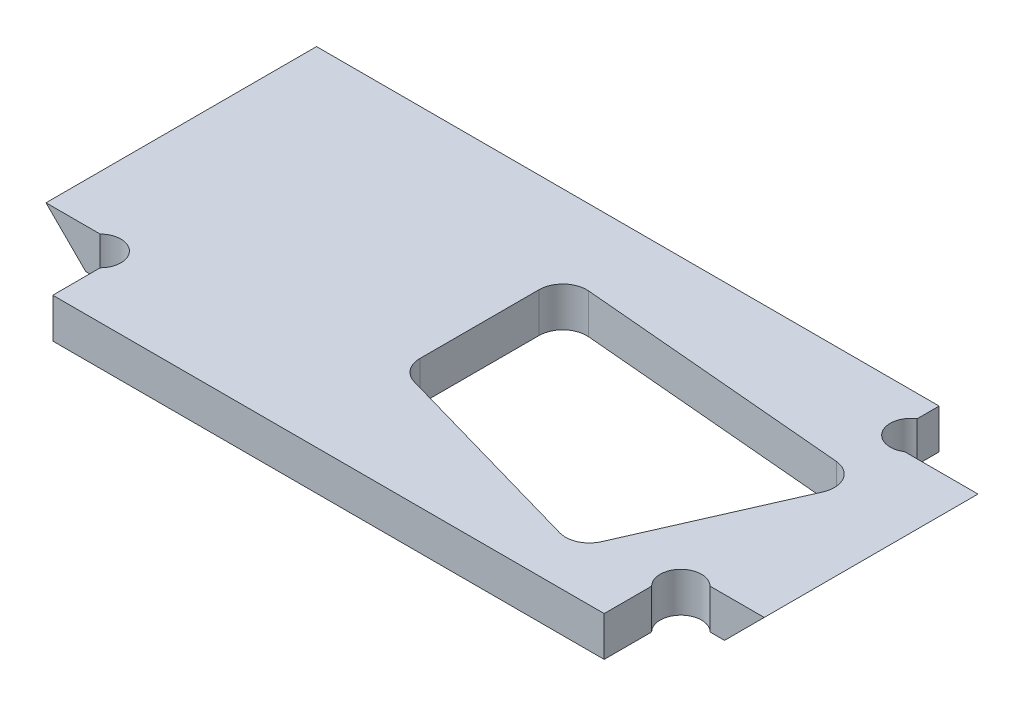
ISO-10303-21;
HEADER;
FILE_DESCRIPTION(('STEP AP214'),'2;1');
FILE_NAME('part.step','',(''),(''),'','','');
FILE_SCHEMA(('AUTOMOTIVE_DESIGN { 1 0 10303 214 1 1 1 1 }'));
ENDSEC;
DATA;
#1=APPLICATION_CONTEXT('core data for automotive mechanical design processes');
#2=APPLICATION_PROTOCOL_DEFINITION('international standard','automotive_design',2000,#1);
#3=PRODUCT_CONTEXT('',#1,'mechanical');
#4=PRODUCT('Part','Part','',(#3));
#5=PRODUCT_RELATED_PRODUCT_CATEGORY('part','',(#4));
#6=PRODUCT_DEFINITION_FORMATION('','',#4);
#7=PRODUCT_DEFINITION_CONTEXT('part definition',#1,'design');
#8=PRODUCT_DEFINITION('design','',#6,#7);
#9=PRODUCT_DEFINITION_SHAPE('','',#8);
#10=(LENGTH_UNIT() NAMED_UNIT(*) SI_UNIT(.MILLI.,.METRE.));
#11=(NAMED_UNIT(*) PLANE_ANGLE_UNIT() SI_UNIT($,.RADIAN.));
#12=(NAMED_UNIT(*) SI_UNIT($,.STERADIAN.) SOLID_ANGLE_UNIT());
#13=UNCERTAINTY_MEASURE_WITH_UNIT(LENGTH_MEASURE(1.E-05),#10,'distance_accuracy_value','');
#14=(GEOMETRIC_REPRESENTATION_CONTEXT(3) GLOBAL_UNCERTAINTY_ASSIGNED_CONTEXT((#13)) GLOBAL_UNIT_ASSIGNED_CONTEXT((#10,
#11,#12)) REPRESENTATION_CONTEXT('',''));
#15=CARTESIAN_POINT('',(0.,0.,0.));
#16=DIRECTION('',(0.,0.,1.));
#17=DIRECTION('',(1.,0.,0.));
#18=AXIS2_PLACEMENT_3D('',#15,#16,#17);
#19=CARTESIAN_POINT('',(-114.808,12.7,-77.1308478006368));
#20=DIRECTION('',(-0.707106781186546,-0.707106781186549,0.));
#21=DIRECTION('',(0.707106781186549,-0.707106781186546,0.));
#22=AXIS2_PLACEMENT_3D('',#19,#20,#21);
#23=PLANE('',#22);
#24=DIRECTION('',(0.,0.,-1.));
#25=VECTOR('',#24,1.);
#26=CARTESIAN_POINT('',(-102.108,0.,-77.1308478006368));
#27=LINE('',#26,#25);
#28=CARTESIAN_POINT('',(-102.108,0.,-77.1308478006368));
#29=VERTEX_POINT('',#28);
#30=CARTESIAN_POINT('',(-102.108,0.,9.35615219936411));
#31=VERTEX_POINT('',#30);
#32=EDGE_CURVE('E328',#29,#31,#27,.F.);
#33=ORIENTED_EDGE('',*,*,#32,.T.);
#34=DIRECTION('',(0.707106781186549,-0.707106781186546,0.));
#35=VECTOR('',#34,1.);
#36=CARTESIAN_POINT('',(-114.808,12.7,9.35615219936411));
#37=LINE('',#36,#35);
#38=CARTESIAN_POINT('',(-114.808,12.7,9.35615219936411));
#39=VERTEX_POINT('',#38);
#40=EDGE_CURVE('E325',#31,#39,#37,.F.);
#41=ORIENTED_EDGE('',*,*,#40,.T.);
#42=DIRECTION('',(0.,0.,1.));
#43=VECTOR('',#42,1.);
#44=CARTESIAN_POINT('',(-114.808,12.7,-77.1308478006368));
#45=LINE('',#44,#43);
#46=CARTESIAN_POINT('',(-114.808,12.7,-77.1308478006368));
#47=VERTEX_POINT('',#46);
#48=EDGE_CURVE('E329',#47,#39,#45,.T.);
#49=ORIENTED_EDGE('',*,*,#48,.F.);
#50=DIRECTION('',(-0.707106781186549,0.707106781186546,0.));
#51=VECTOR('',#50,1.);
#52=CARTESIAN_POINT('',(-114.808,12.7,-77.1308478006368));
#53=LINE('',#52,#51);
#54=EDGE_CURVE('E49',#47,#29,#53,.F.);
#55=ORIENTED_EDGE('',*,*,#54,.T.);
#56=EDGE_LOOP('',(#33,#41,#49,#55));
#57=FACE_BOUND('',#56,.T.);
#58=ADVANCED_FACE('F41',(#57),#23,.T.);
#59=CARTESIAN_POINT('',(-114.808,12.7,33.8671521993641));
#60=DIRECTION('',(0.,0.,-1.));
#61=DIRECTION('',(-1.,0.,0.));
#62=AXIS2_PLACEMENT_3D('',#59,#60,#61);
#63=PLANE('',#62);
#64=DIRECTION('',(1.,0.,0.));
#65=VECTOR('',#64,1.);
#66=CARTESIAN_POINT('',(-114.808,12.7,33.8671521993641));
#67=LINE('',#66,#65);
#68=CARTESIAN_POINT('',(-88.138,12.7,33.8671521993641));
#69=VERTEX_POINT('',#68);
#70=CARTESIAN_POINT('',(88.138,12.7,33.8671521993641));
#71=VERTEX_POINT('',#70);
#72=EDGE_CURVE('E332',#69,#71,#67,.T.);
#73=ORIENTED_EDGE('',*,*,#72,.F.);
#74=DIRECTION('',(0.,1.,0.));
#75=VECTOR('',#74,1.);
#76=CARTESIAN_POINT('',(-88.138,0.,33.8671521993641));
#77=LINE('',#76,#75);
#78=CARTESIAN_POINT('',(-88.138,0.,33.8671521993641));
#79=VERTEX_POINT('',#78);
#80=EDGE_CURVE('E263',#79,#69,#77,.T.);
#81=ORIENTED_EDGE('',*,*,#80,.F.);
#82=DIRECTION('',(1.,0.,0.));
#83=VECTOR('',#82,1.);
#84=CARTESIAN_POINT('',(-114.808,0.,33.8671521993641));
#85=LINE('',#84,#83);
#86=CARTESIAN_POINT('',(88.138,0.,33.8671521993641));
#87=VERTEX_POINT('',#86);
#88=EDGE_CURVE('E341',#79,#87,#85,.T.);
#89=ORIENTED_EDGE('',*,*,#88,.T.);
#90=DIRECTION('',(0.,1.,0.));
#91=VECTOR('',#90,1.);
#92=CARTESIAN_POINT('',(88.138,0.,33.8671521993641));
#93=LINE('',#92,#91);
#94=EDGE_CURVE('E281',#87,#71,#93,.T.);
#95=ORIENTED_EDGE('',*,*,#94,.T.);
#96=EDGE_LOOP('',(#73,#81,#89,#95));
#97=FACE_BOUND('',#96,.T.);
#98=ADVANCED_FACE('F379',(#97),#63,.F.);
#99=CARTESIAN_POINT('',(114.808,12.7,-77.1308478006368));
#100=DIRECTION('',(0.707106781186546,-0.707106781186549,0.));
#101=DIRECTION('',(0.707106781186549,0.707106781186546,0.));
#102=AXIS2_PLACEMENT_3D('',#99,#100,#101);
#103=PLANE('',#102);
#104=DIRECTION('',(0.,0.,-1.));
#105=VECTOR('',#104,1.);
#106=CARTESIAN_POINT('',(114.808,12.7,-77.1308478006368));
#107=LINE('',#106,#105);
#108=CARTESIAN_POINT('',(114.808,12.7,9.35615219936409));
#109=VERTEX_POINT('',#108);
#110=CARTESIAN_POINT('',(114.808,12.7,-58.9698478006368));
#111=VERTEX_POINT('',#110);
#112=EDGE_CURVE('E336',#109,#111,#107,.T.);
#113=ORIENTED_EDGE('',*,*,#112,.F.);
#114=DIRECTION('',(0.707106781186549,0.707106781186546,0.));
#115=VECTOR('',#114,1.);
#116=CARTESIAN_POINT('',(114.808,12.7,9.35615219936409));
#117=LINE('',#116,#115);
#118=CARTESIAN_POINT('',(102.108,0.,9.35615219936409));
#119=VERTEX_POINT('',#118);
#120=EDGE_CURVE('E322',#109,#119,#117,.F.);
#121=ORIENTED_EDGE('',*,*,#120,.T.);
#122=DIRECTION('',(0.,0.,1.));
#123=VECTOR('',#122,1.);
#124=CARTESIAN_POINT('',(102.108,0.,-77.1308478006368));
#125=LINE('',#124,#123);
#126=CARTESIAN_POINT('',(102.108,0.,-58.9698478006368));
#127=VERTEX_POINT('',#126);
#128=EDGE_CURVE('E344',#119,#127,#125,.F.);
#129=ORIENTED_EDGE('',*,*,#128,.T.);
#130=DIRECTION('',(-0.707106781186549,-0.707106781186546,0.));
#131=VECTOR('',#130,1.);
#132=CARTESIAN_POINT('',(114.808,12.7,-58.9698478006368));
#133=LINE('',#132,#131);
#134=EDGE_CURVE('E274',#127,#111,#133,.F.);
#135=ORIENTED_EDGE('',*,*,#134,.T.);
#136=EDGE_LOOP('',(#113,#121,#129,#135));
#137=FACE_BOUND('',#136,.T.);
#138=ADVANCED_FACE('F43',(#137),#103,.T.);
#139=CARTESIAN_POINT('',(-114.808,12.7,-77.1308478006368));
#140=DIRECTION('',(0.,0.,1.));
#141=DIRECTION('',(1.,0.,0.));
#142=AXIS2_PLACEMENT_3D('',#139,#140,#141);
#143=PLANE('',#142);
#144=DIRECTION('',(-1.,0.,0.));
#145=VECTOR('',#144,1.);
#146=CARTESIAN_POINT('',(-114.808,12.7,-77.1308478006368));
#147=LINE('',#146,#145);
#148=CARTESIAN_POINT('',(84.2245851126406,12.7,-77.1308478006369));
#149=VERTEX_POINT('',#148);
#150=EDGE_CURVE('E339',#149,#47,#147,.T.);
#151=ORIENTED_EDGE('',*,*,#150,.F.);
#152=DIRECTION('',(0.,1.,0.));
#153=VECTOR('',#152,1.);
#154=CARTESIAN_POINT('',(84.2245851126406,0.,-77.1308478006369));
#155=LINE('',#154,#153);
#156=CARTESIAN_POINT('',(84.2245851126406,0.,-77.1308478006369));
#157=VERTEX_POINT('',#156);
#158=EDGE_CURVE('E241',#157,#149,#155,.T.);
#159=ORIENTED_EDGE('',*,*,#158,.F.);
#160=DIRECTION('',(-1.,0.,0.));
#161=VECTOR('',#160,1.);
#162=CARTESIAN_POINT('',(-114.808,0.,-77.1308478006368));
#163=LINE('',#162,#161);
#164=EDGE_CURVE('E333',#157,#29,#163,.T.);
#165=ORIENTED_EDGE('',*,*,#164,.T.);
#166=ORIENTED_EDGE('',*,*,#54,.F.);
#167=EDGE_LOOP('',(#151,#159,#165,#166));
#168=FACE_BOUND('',#167,.T.);
#169=ADVANCED_FACE('F396',(#168),#143,.F.);
#170=CARTESIAN_POINT('',(0.,12.7,0.));
#171=DIRECTION('',(0.,1.,0.));
#172=DIRECTION('',(0.,0.,1.));
#173=AXIS2_PLACEMENT_3D('',#170,#171,#172);
#174=PLANE('',#173);
#175=CARTESIAN_POINT('',(60.8428177396409,12.7,11.2992328279351));
#176=DIRECTION('',(0.,1.,0.));
#177=DIRECTION('',(0.,0.,-1.));
#178=AXIS2_PLACEMENT_3D('',#175,#176,#177);
#179=CIRCLE('',#178,7.62);
#180=CARTESIAN_POINT('',(58.7533207461433,12.7,18.6271521993641));
#181=VERTEX_POINT('',#180);
#182=CARTESIAN_POINT('',(67.818,12.7,14.3670060325203));
#183=VERTEX_POINT('',#182);
#184=EDGE_CURVE('E56',#181,#183,#179,.T.);
#185=ORIENTED_EDGE('',*,*,#184,.F.);
#186=DIRECTION('',(0.961669208848951,0.,0.274212203871078));
#187=VECTOR('',#186,1.);
#188=CARTESIAN_POINT('',(58.7533207461433,12.7,18.6271521993641));
#189=LINE('',#188,#187);
#190=CARTESIAN_POINT('',(-6.40749699349761,12.7,0.0470715707921576));
#191=VERTEX_POINT('',#190);
#192=EDGE_CURVE('E203',#191,#181,#189,.T.);
#193=ORIENTED_EDGE('',*,*,#192,.F.);
#194=CARTESIAN_POINT('',(-4.318,12.7,-7.28084780063684));
#195=DIRECTION('',(0.,1.,0.));
#196=DIRECTION('',(0.,0.,-1.));
#197=AXIS2_PLACEMENT_3D('',#194,#195,#196);
#198=CIRCLE('',#197,7.61999999999999);
#199=CARTESIAN_POINT('',(-11.938,12.7,-7.28084780063684));
#200=VERTEX_POINT('',#199);
#201=EDGE_CURVE('E206',#200,#191,#198,.T.);
#202=ORIENTED_EDGE('',*,*,#201,.F.);
#203=DIRECTION('',(0.,0.,1.));
#204=VECTOR('',#203,1.);
#205=CARTESIAN_POINT('',(-11.938,12.7,-7.28084780063684));
#206=LINE('',#205,#204);
#207=CARTESIAN_POINT('',(-11.938,12.7,-45.3808478006368));
#208=VERTEX_POINT('',#207);
#209=EDGE_CURVE('E234',#208,#200,#206,.T.);
#210=ORIENTED_EDGE('',*,*,#209,.F.);
#211=CARTESIAN_POINT('',(-4.318,12.7,-45.3808478006368));
#212=DIRECTION('',(0.,1.,0.));
#213=DIRECTION('',(0.,0.,1.));
#214=AXIS2_PLACEMENT_3D('',#211,#212,#213);
#215=CIRCLE('',#214,7.62000000000001);
#216=CARTESIAN_POINT('',(-3.65376202037241,12.7,-52.9718416687954));
#217=VERTEX_POINT('',#216);
#218=EDGE_CURVE('E231',#217,#208,#215,.T.);
#219=ORIENTED_EDGE('',*,*,#218,.F.);
#220=DIRECTION('',(-0.996193421018179,0.,-0.0871703385338045));
#221=VECTOR('',#220,1.);
#222=CARTESIAN_POINT('',(-3.65376202037241,12.7,-52.9718416687954));
#223=LINE('',#222,#221);
#224=CARTESIAN_POINT('',(83.0970557192684,12.7,-45.3808478006368));
#225=VERTEX_POINT('',#224);
#226=EDGE_CURVE('E228',#225,#217,#223,.T.);
#227=ORIENTED_EDGE('',*,*,#226,.F.);
#228=CARTESIAN_POINT('',(82.4328177396408,12.7,-37.7898539324783));
#229=DIRECTION('',(0.,1.,0.));
#230=DIRECTION('',(0.,0.,-1.));
#231=AXIS2_PLACEMENT_3D('',#228,#229,#230);
#232=CIRCLE('',#231,7.62000000000001);
#233=CARTESIAN_POINT('',(89.408,12.7,-34.7220807278931));
#234=VERTEX_POINT('',#233);
#235=EDGE_CURVE('E225',#234,#225,#232,.T.);
#236=ORIENTED_EDGE('',*,*,#235,.F.);
#237=DIRECTION('',(0.402594908738214,0.,-0.915378249390966));
#238=VECTOR('',#237,1.);
#239=CARTESIAN_POINT('',(89.408,12.7,-34.7220807278931));
#240=LINE('',#239,#238);
#241=EDGE_CURVE('E223',#183,#234,#240,.T.);
#242=ORIENTED_EDGE('',*,*,#241,.F.);
#243=EDGE_LOOP('',(#185,#193,#202,#210,#219,#227,#236,#242));
#244=FACE_BOUND('',#243,.T.);
#245=DIRECTION('',(-1.,0.,0.));
#246=VECTOR('',#245,1.);
#247=CARTESIAN_POINT('',(-114.808,12.7,9.35615219936411));
#248=LINE('',#247,#246);
#249=CARTESIAN_POINT('',(-97.4774663659119,12.7,9.35615219936411));
#250=VERTEX_POINT('',#249);
#251=EDGE_CURVE('E257',#250,#39,#248,.T.);
#252=ORIENTED_EDGE('',*,*,#251,.F.);
#253=CARTESIAN_POINT('',(-92.807733182956,12.7,14.0258853823201));
#254=DIRECTION('',(0.,1.,0.));
#255=DIRECTION('',(0.,0.,1.));
#256=AXIS2_PLACEMENT_3D('',#253,#254,#255);
#257=CIRCLE('',#256,6.60400000000001);
#258=CARTESIAN_POINT('',(-88.138,12.7,18.695618565276));
#259=VERTEX_POINT('',#258);
#260=EDGE_CURVE('E267',#259,#250,#257,.T.);
#261=ORIENTED_EDGE('',*,*,#260,.F.);
#262=DIRECTION('',(0.,0.,-1.));
#263=VECTOR('',#262,1.);
#264=CARTESIAN_POINT('',(-88.138,12.7,18.695618565276));
#265=LINE('',#264,#263);
#266=EDGE_CURVE('E264',#69,#259,#265,.T.);
#267=ORIENTED_EDGE('',*,*,#266,.F.);
#268=ORIENTED_EDGE('',*,*,#72,.T.);
#269=DIRECTION('',(0.,0.,1.));
#270=VECTOR('',#269,1.);
#271=CARTESIAN_POINT('',(88.138,12.7,18.695618565276));
#272=LINE('',#271,#270);
#273=CARTESIAN_POINT('',(88.138,12.7,18.695618565276));
#274=VERTEX_POINT('',#273);
#275=EDGE_CURVE('E290',#274,#71,#272,.T.);
#276=ORIENTED_EDGE('',*,*,#275,.F.);
#277=CARTESIAN_POINT('',(92.807733182956,12.7,14.02588538232));
#278=DIRECTION('',(0.,1.,0.));
#279=DIRECTION('',(0.,0.,-1.));
#280=AXIS2_PLACEMENT_3D('',#277,#278,#279);
#281=CIRCLE('',#280,6.60400000000001);
#282=CARTESIAN_POINT('',(97.477466365912,12.7,9.35615219936409));
#283=VERTEX_POINT('',#282);
#284=EDGE_CURVE('E268',#283,#274,#281,.T.);
#285=ORIENTED_EDGE('',*,*,#284,.F.);
#286=DIRECTION('',(-1.,0.,0.));
#287=VECTOR('',#286,1.);
#288=CARTESIAN_POINT('',(114.808,12.7,9.35615219936409));
#289=LINE('',#288,#287);
#290=EDGE_CURVE('E287',#109,#283,#289,.T.);
#291=ORIENTED_EDGE('',*,*,#290,.F.);
#292=ORIENTED_EDGE('',*,*,#112,.T.);
#293=DIRECTION('',(1.,0.,0.));
#294=VECTOR('',#293,1.);
#295=CARTESIAN_POINT('',(91.3365851126406,12.7,-58.9698478006368));
#296=LINE('',#295,#294);
#297=CARTESIAN_POINT('',(91.3365851126406,12.7,-58.9698478006368));
#298=VERTEX_POINT('',#297);
#299=EDGE_CURVE('E305',#298,#111,#296,.T.);
#300=ORIENTED_EDGE('',*,*,#299,.F.);
#301=CARTESIAN_POINT('',(87.7805851126406,12.7,-64.5347089848893));
#302=DIRECTION('',(0.,1.,0.));
#303=DIRECTION('',(0.,0.,1.));
#304=AXIS2_PLACEMENT_3D('',#301,#302,#303);
#305=CIRCLE('',#304,6.604);
#306=CARTESIAN_POINT('',(84.2245851126406,12.7,-70.0995701691418));
#307=VERTEX_POINT('',#306);
#308=EDGE_CURVE('E307',#307,#298,#305,.T.);
#309=ORIENTED_EDGE('',*,*,#308,.F.);
#310=DIRECTION('',(0.,0.,1.));
#311=VECTOR('',#310,1.);
#312=CARTESIAN_POINT('',(84.2245851126406,12.7,-77.1308478006369));
#313=LINE('',#312,#311);
#314=EDGE_CURVE('E286',#149,#307,#313,.T.);
#315=ORIENTED_EDGE('',*,*,#314,.F.);
#316=ORIENTED_EDGE('',*,*,#150,.T.);
#317=ORIENTED_EDGE('',*,*,#48,.T.);
#318=EDGE_LOOP('',(#252,#261,#267,#268,#276,#285,#291,#292,#300,#309,#315,#316,#317));
#319=FACE_BOUND('',#318,.T.);
#320=ADVANCED_FACE('F364',(#244,#319),#174,.T.);
#321=CARTESIAN_POINT('',(0.,0.,0.));
#322=DIRECTION('',(0.,1.,0.));
#323=DIRECTION('',(0.,0.,1.));
#324=AXIS2_PLACEMENT_3D('',#321,#322,#323);
#325=PLANE('',#324);
#326=DIRECTION('',(0.961669208848951,0.,0.274212203871078));
#327=VECTOR('',#326,1.);
#328=CARTESIAN_POINT('',(58.7533207461433,0.,18.6271521993641));
#329=LINE('',#328,#327);
#330=CARTESIAN_POINT('',(-6.40749699349761,0.,0.0470715707921576));
#331=VERTEX_POINT('',#330);
#332=CARTESIAN_POINT('',(58.7533207461433,0.,18.6271521993641));
#333=VERTEX_POINT('',#332);
#334=EDGE_CURVE('E192',#331,#333,#329,.T.);
#335=ORIENTED_EDGE('',*,*,#334,.T.);
#336=CARTESIAN_POINT('',(60.8428177396409,0.,11.2992328279351));
#337=DIRECTION('',(0.,1.,0.));
#338=DIRECTION('',(0.,0.,-1.));
#339=AXIS2_PLACEMENT_3D('',#336,#337,#338);
#340=CIRCLE('',#339,7.62);
#341=CARTESIAN_POINT('',(67.818,0.,14.3670060325203));
#342=VERTEX_POINT('',#341);
#343=EDGE_CURVE('E186',#333,#342,#340,.T.);
#344=ORIENTED_EDGE('',*,*,#343,.T.);
#345=DIRECTION('',(0.402594908738214,0.,-0.915378249390966));
#346=VECTOR('',#345,1.);
#347=CARTESIAN_POINT('',(89.408,0.,-34.7220807278931));
#348=LINE('',#347,#346);
#349=CARTESIAN_POINT('',(89.408,0.,-34.7220807278931));
#350=VERTEX_POINT('',#349);
#351=EDGE_CURVE('E195',#342,#350,#348,.T.);
#352=ORIENTED_EDGE('',*,*,#351,.T.);
#353=CARTESIAN_POINT('',(82.4328177396408,0.,-37.7898539324783));
#354=DIRECTION('',(0.,1.,0.));
#355=DIRECTION('',(0.,0.,-1.));
#356=AXIS2_PLACEMENT_3D('',#353,#354,#355);
#357=CIRCLE('',#356,7.62000000000001);
#358=CARTESIAN_POINT('',(83.0970557192684,0.,-45.3808478006368));
#359=VERTEX_POINT('',#358);
#360=EDGE_CURVE('E64',#350,#359,#357,.T.);
#361=ORIENTED_EDGE('',*,*,#360,.T.);
#362=DIRECTION('',(-0.996193421018179,0.,-0.0871703385338045));
#363=VECTOR('',#362,1.);
#364=CARTESIAN_POINT('',(-3.65376202037241,0.,-52.9718416687954));
#365=LINE('',#364,#363);
#366=CARTESIAN_POINT('',(-3.65376202037241,0.,-52.9718416687954));
#367=VERTEX_POINT('',#366);
#368=EDGE_CURVE('E210',#359,#367,#365,.T.);
#369=ORIENTED_EDGE('',*,*,#368,.T.);
#370=CARTESIAN_POINT('',(-4.318,0.,-45.3808478006368));
#371=DIRECTION('',(0.,1.,0.));
#372=DIRECTION('',(0.,0.,1.));
#373=AXIS2_PLACEMENT_3D('',#370,#371,#372);
#374=CIRCLE('',#373,7.62000000000001);
#375=CARTESIAN_POINT('',(-11.938,0.,-45.3808478006368));
#376=VERTEX_POINT('',#375);
#377=EDGE_CURVE('E213',#367,#376,#374,.T.);
#378=ORIENTED_EDGE('',*,*,#377,.T.);
#379=DIRECTION('',(0.,0.,1.));
#380=VECTOR('',#379,1.);
#381=CARTESIAN_POINT('',(-11.938,0.,-7.28084780063684));
#382=LINE('',#381,#380);
#383=CARTESIAN_POINT('',(-11.938,0.,-7.28084780063684));
#384=VERTEX_POINT('',#383);
#385=EDGE_CURVE('E216',#376,#384,#382,.T.);
#386=ORIENTED_EDGE('',*,*,#385,.T.);
#387=CARTESIAN_POINT('',(-4.318,0.,-7.28084780063684));
#388=DIRECTION('',(0.,1.,0.));
#389=DIRECTION('',(0.,0.,-1.));
#390=AXIS2_PLACEMENT_3D('',#387,#388,#389);
#391=CIRCLE('',#390,7.61999999999999);
#392=EDGE_CURVE('E219',#384,#331,#391,.T.);
#393=ORIENTED_EDGE('',*,*,#392,.T.);
#394=EDGE_LOOP('',(#335,#344,#352,#361,#369,#378,#386,#393));
#395=FACE_BOUND('',#394,.T.);
#396=CARTESIAN_POINT('',(-92.807733182956,0.,14.0258853823201));
#397=DIRECTION('',(0.,1.,0.));
#398=DIRECTION('',(0.,0.,1.));
#399=AXIS2_PLACEMENT_3D('',#396,#397,#398);
#400=CIRCLE('',#399,6.60400000000001);
#401=CARTESIAN_POINT('',(-88.138,0.,18.695618565276));
#402=VERTEX_POINT('',#401);
#403=CARTESIAN_POINT('',(-97.4774663659119,0.,9.35615219936411));
#404=VERTEX_POINT('',#403);
#405=EDGE_CURVE('E256',#402,#404,#400,.T.);
#406=ORIENTED_EDGE('',*,*,#405,.T.);
#407=DIRECTION('',(-1.,0.,0.));
#408=VECTOR('',#407,1.);
#409=CARTESIAN_POINT('',(-114.808,0.,9.35615219936411));
#410=LINE('',#409,#408);
#411=EDGE_CURVE('E260',#404,#31,#410,.T.);
#412=ORIENTED_EDGE('',*,*,#411,.T.);
#413=ORIENTED_EDGE('',*,*,#32,.F.);
#414=ORIENTED_EDGE('',*,*,#164,.F.);
#415=DIRECTION('',(0.,0.,1.));
#416=VECTOR('',#415,1.);
#417=CARTESIAN_POINT('',(84.2245851126406,0.,-77.1308478006369));
#418=LINE('',#417,#416);
#419=CARTESIAN_POINT('',(84.2245851126406,0.,-70.0995701691418));
#420=VERTEX_POINT('',#419);
#421=EDGE_CURVE('E308',#157,#420,#418,.T.);
#422=ORIENTED_EDGE('',*,*,#421,.T.);
#423=CARTESIAN_POINT('',(87.7805851126406,0.,-64.5347089848893));
#424=DIRECTION('',(0.,1.,0.));
#425=DIRECTION('',(0.,0.,1.));
#426=AXIS2_PLACEMENT_3D('',#423,#424,#425);
#427=CIRCLE('',#426,6.604);
#428=CARTESIAN_POINT('',(91.3365851126406,0.,-58.9698478006368));
#429=VERTEX_POINT('',#428);
#430=EDGE_CURVE('E315',#420,#429,#427,.T.);
#431=ORIENTED_EDGE('',*,*,#430,.T.);
#432=DIRECTION('',(1.,0.,0.));
#433=VECTOR('',#432,1.);
#434=CARTESIAN_POINT('',(91.3365851126406,0.,-58.9698478006368));
#435=LINE('',#434,#433);
#436=EDGE_CURVE('E301',#429,#127,#435,.T.);
#437=ORIENTED_EDGE('',*,*,#436,.T.);
#438=ORIENTED_EDGE('',*,*,#128,.F.);
#439=DIRECTION('',(-1.,0.,0.));
#440=VECTOR('',#439,1.);
#441=CARTESIAN_POINT('',(0.,0.,9.3561521993641));
#442=LINE('',#441,#440);
#443=CARTESIAN_POINT('',(97.477466365912,0.,9.35615219936409));
#444=VERTEX_POINT('',#443);
#445=EDGE_CURVE('E11',#119,#444,#442,.T.);
#446=ORIENTED_EDGE('',*,*,#445,.T.);
#447=CARTESIAN_POINT('',(92.807733182956,0.,14.02588538232));
#448=DIRECTION('',(0.,1.,0.));
#449=DIRECTION('',(0.,0.,-1.));
#450=AXIS2_PLACEMENT_3D('',#447,#448,#449);
#451=CIRCLE('',#450,6.60400000000001);
#452=CARTESIAN_POINT('',(88.138,0.,18.695618565276));
#453=VERTEX_POINT('',#452);
#454=EDGE_CURVE('E291',#444,#453,#451,.T.);
#455=ORIENTED_EDGE('',*,*,#454,.T.);
#456=DIRECTION('',(0.,0.,1.));
#457=VECTOR('',#456,1.);
#458=CARTESIAN_POINT('',(88.138,0.,18.695618565276));
#459=LINE('',#458,#457);
#460=EDGE_CURVE('E280',#453,#87,#459,.T.);
#461=ORIENTED_EDGE('',*,*,#460,.T.);
#462=ORIENTED_EDGE('',*,*,#88,.F.);
#463=DIRECTION('',(0.,0.,-1.));
#464=VECTOR('',#463,1.);
#465=CARTESIAN_POINT('',(-88.138,0.,18.695618565276));
#466=LINE('',#465,#464);
#467=EDGE_CURVE('E253',#79,#402,#466,.T.);
#468=ORIENTED_EDGE('',*,*,#467,.T.);
#469=EDGE_LOOP('',(#406,#412,#413,#414,#422,#431,#437,#438,#446,#455,#461,#462,#468));
#470=FACE_BOUND('',#469,.T.);
#471=ADVANCED_FACE('F199',(#395,#470),#325,.F.);
#472=CARTESIAN_POINT('',(91.3365851126406,0.,-58.9698478006368));
#473=DIRECTION('',(0.,0.,1.));
#474=DIRECTION('',(1.,0.,0.));
#475=AXIS2_PLACEMENT_3D('',#472,#473,#474);
#476=PLANE('',#475);
#477=ORIENTED_EDGE('',*,*,#436,.F.);
#478=DIRECTION('',(0.,1.,0.));
#479=VECTOR('',#478,1.);
#480=CARTESIAN_POINT('',(91.3365851126406,0.,-58.9698478006368));
#481=LINE('',#480,#479);
#482=EDGE_CURVE('E302',#429,#298,#481,.T.);
#483=ORIENTED_EDGE('',*,*,#482,.T.);
#484=ORIENTED_EDGE('',*,*,#299,.T.);
#485=ORIENTED_EDGE('',*,*,#134,.F.);
#486=EDGE_LOOP('',(#477,#483,#484,#485));
#487=FACE_BOUND('',#486,.T.);
#488=ADVANCED_FACE('F356',(#487),#476,.F.);
#489=CARTESIAN_POINT('',(84.2245851126406,0.,-77.1308478006369));
#490=DIRECTION('',(-1.,0.,0.));
#491=DIRECTION('',(0.,0.,1.));
#492=AXIS2_PLACEMENT_3D('',#489,#490,#491);
#493=PLANE('',#492);
#494=ORIENTED_EDGE('',*,*,#314,.T.);
#495=DIRECTION('',(0.,1.,0.));
#496=VECTOR('',#495,1.);
#497=CARTESIAN_POINT('',(84.2245851126406,0.,-70.0995701691418));
#498=LINE('',#497,#496);
#499=EDGE_CURVE('E299',#420,#307,#498,.T.);
#500=ORIENTED_EDGE('',*,*,#499,.F.);
#501=ORIENTED_EDGE('',*,*,#421,.F.);
#502=ORIENTED_EDGE('',*,*,#158,.T.);
#503=EDGE_LOOP('',(#494,#500,#501,#502));
#504=FACE_BOUND('',#503,.T.);
#505=ADVANCED_FACE('F399',(#504),#493,.F.);
#506=CARTESIAN_POINT('',(87.7805851126406,0.,-64.5347089848893));
#507=DIRECTION('',(0.,1.,0.));
#508=DIRECTION('',(0.,0.,1.));
#509=AXIS2_PLACEMENT_3D('',#506,#507,#508);
#510=CYLINDRICAL_SURFACE('',#509,6.604);
#511=ORIENTED_EDGE('',*,*,#308,.T.);
#512=ORIENTED_EDGE('',*,*,#482,.F.);
#513=ORIENTED_EDGE('',*,*,#430,.F.);
#514=ORIENTED_EDGE('',*,*,#499,.T.);
#515=EDGE_LOOP('',(#511,#512,#513,#514));
#516=FACE_BOUND('',#515,.T.);
#517=ADVANCED_FACE('F358',(#516),#510,.F.);
#518=CARTESIAN_POINT('',(114.808,0.,9.35615219936409));
#519=DIRECTION('',(0.,0.,-1.));
#520=DIRECTION('',(-1.,0.,0.));
#521=AXIS2_PLACEMENT_3D('',#518,#519,#520);
#522=PLANE('',#521);
#523=ORIENTED_EDGE('',*,*,#290,.T.);
#524=DIRECTION('',(0.,1.,0.));
#525=VECTOR('',#524,1.);
#526=CARTESIAN_POINT('',(97.477466365912,0.,9.35615219936409));
#527=LINE('',#526,#525);
#528=EDGE_CURVE('E284',#444,#283,#527,.T.);
#529=ORIENTED_EDGE('',*,*,#528,.F.);
#530=ORIENTED_EDGE('',*,*,#445,.F.);
#531=ORIENTED_EDGE('',*,*,#120,.F.);
#532=EDGE_LOOP('',(#523,#529,#530,#531));
#533=FACE_BOUND('',#532,.T.);
#534=ADVANCED_FACE('F369',(#533),#522,.F.);
#535=CARTESIAN_POINT('',(92.807733182956,0.,14.02588538232));
#536=DIRECTION('',(0.,1.,0.));
#537=DIRECTION('',(0.,0.,1.));
#538=AXIS2_PLACEMENT_3D('',#535,#536,#537);
#539=CYLINDRICAL_SURFACE('',#538,6.60400000000001);
#540=ORIENTED_EDGE('',*,*,#284,.T.);
#541=DIRECTION('',(0.,1.,0.));
#542=VECTOR('',#541,1.);
#543=CARTESIAN_POINT('',(88.138,0.,18.695618565276));
#544=LINE('',#543,#542);
#545=EDGE_CURVE('E278',#453,#274,#544,.T.);
#546=ORIENTED_EDGE('',*,*,#545,.F.);
#547=ORIENTED_EDGE('',*,*,#454,.F.);
#548=ORIENTED_EDGE('',*,*,#528,.T.);
#549=EDGE_LOOP('',(#540,#546,#547,#548));
#550=FACE_BOUND('',#549,.T.);
#551=ADVANCED_FACE('F372',(#550),#539,.F.);
#552=CARTESIAN_POINT('',(88.138,0.,18.695618565276));
#553=DIRECTION('',(-1.,0.,0.));
#554=DIRECTION('',(0.,0.,1.));
#555=AXIS2_PLACEMENT_3D('',#552,#553,#554);
#556=PLANE('',#555);
#557=ORIENTED_EDGE('',*,*,#275,.T.);
#558=ORIENTED_EDGE('',*,*,#94,.F.);
#559=ORIENTED_EDGE('',*,*,#460,.F.);
#560=ORIENTED_EDGE('',*,*,#545,.T.);
#561=EDGE_LOOP('',(#557,#558,#559,#560));
#562=FACE_BOUND('',#561,.T.);
#563=ADVANCED_FACE('F467',(#562),#556,.F.);
#564=CARTESIAN_POINT('',(-114.808,0.,9.35615219936411));
#565=DIRECTION('',(0.,0.,-1.));
#566=DIRECTION('',(-1.,0.,0.));
#567=AXIS2_PLACEMENT_3D('',#564,#565,#566);
#568=PLANE('',#567);
#569=ORIENTED_EDGE('',*,*,#411,.F.);
#570=DIRECTION('',(0.,1.,0.));
#571=VECTOR('',#570,1.);
#572=CARTESIAN_POINT('',(-97.4774663659119,0.,9.35615219936411));
#573=LINE('',#572,#571);
#574=EDGE_CURVE('E272',#404,#250,#573,.T.);
#575=ORIENTED_EDGE('',*,*,#574,.T.);
#576=ORIENTED_EDGE('',*,*,#251,.T.);
#577=ORIENTED_EDGE('',*,*,#40,.F.);
#578=EDGE_LOOP('',(#569,#575,#576,#577));
#579=FACE_BOUND('',#578,.T.);
#580=ADVANCED_FACE('F464',(#579),#568,.F.);
#581=CARTESIAN_POINT('',(-92.807733182956,0.,14.0258853823201));
#582=DIRECTION('',(0.,1.,0.));
#583=DIRECTION('',(0.,0.,1.));
#584=AXIS2_PLACEMENT_3D('',#581,#582,#583);
#585=CYLINDRICAL_SURFACE('',#584,6.60400000000001);
#586=ORIENTED_EDGE('',*,*,#260,.T.);
#587=ORIENTED_EDGE('',*,*,#574,.F.);
#588=ORIENTED_EDGE('',*,*,#405,.F.);
#589=DIRECTION('',(0.,1.,0.));
#590=VECTOR('',#589,1.);
#591=CARTESIAN_POINT('',(-88.138,0.,18.695618565276));
#592=LINE('',#591,#590);
#593=EDGE_CURVE('E275',#402,#259,#592,.T.);
#594=ORIENTED_EDGE('',*,*,#593,.T.);
#595=EDGE_LOOP('',(#586,#587,#588,#594));
#596=FACE_BOUND('',#595,.T.);
#597=ADVANCED_FACE('F386',(#596),#585,.F.);
#598=CARTESIAN_POINT('',(-88.138,0.,18.695618565276));
#599=DIRECTION('',(1.,0.,0.));
#600=DIRECTION('',(0.,0.,-1.));
#601=AXIS2_PLACEMENT_3D('',#598,#599,#600);
#602=PLANE('',#601);
#603=ORIENTED_EDGE('',*,*,#266,.T.);
#604=ORIENTED_EDGE('',*,*,#593,.F.);
#605=ORIENTED_EDGE('',*,*,#467,.F.);
#606=ORIENTED_EDGE('',*,*,#80,.T.);
#607=EDGE_LOOP('',(#603,#604,#605,#606));
#608=FACE_BOUND('',#607,.T.);
#609=ADVANCED_FACE('F382',(#608),#602,.F.);
#610=CARTESIAN_POINT('',(60.8428177396409,0.,11.2992328279351));
#611=DIRECTION('',(0.,1.,0.));
#612=DIRECTION('',(0.,0.,1.));
#613=AXIS2_PLACEMENT_3D('',#610,#611,#612);
#614=CYLINDRICAL_SURFACE('',#613,7.62);
#615=ORIENTED_EDGE('',*,*,#184,.T.);
#616=DIRECTION('',(0.,1.,0.));
#617=VECTOR('',#616,1.);
#618=CARTESIAN_POINT('',(67.818,0.,14.3670060325203));
#619=LINE('',#618,#617);
#620=EDGE_CURVE('E182',#342,#183,#619,.T.);
#621=ORIENTED_EDGE('',*,*,#620,.F.);
#622=ORIENTED_EDGE('',*,*,#343,.F.);
#623=DIRECTION('',(0.,1.,0.));
#624=VECTOR('',#623,1.);
#625=CARTESIAN_POINT('',(58.7533207461433,0.,18.6271521993641));
#626=LINE('',#625,#624);
#627=EDGE_CURVE('E239',#333,#181,#626,.T.);
#628=ORIENTED_EDGE('',*,*,#627,.T.);
#629=EDGE_LOOP('',(#615,#621,#622,#628));
#630=FACE_BOUND('',#629,.T.);
#631=ADVANCED_FACE('F184',(#630),#614,.F.);
#632=CARTESIAN_POINT('',(58.7533207461433,0.,18.6271521993641));
#633=DIRECTION('',(-0.274212203871078,0.,0.961669208848951));
#634=DIRECTION('',(0.961669208848951,0.,0.274212203871078));
#635=AXIS2_PLACEMENT_3D('',#632,#633,#634);
#636=PLANE('',#635);
#637=ORIENTED_EDGE('',*,*,#192,.T.);
#638=ORIENTED_EDGE('',*,*,#627,.F.);
#639=ORIENTED_EDGE('',*,*,#334,.F.);
#640=DIRECTION('',(0.,1.,0.));
#641=VECTOR('',#640,1.);
#642=CARTESIAN_POINT('',(-6.40749699349761,0.,0.0470715707921576));
#643=LINE('',#642,#641);
#644=EDGE_CURVE('E242',#331,#191,#643,.T.);
#645=ORIENTED_EDGE('',*,*,#644,.T.);
#646=EDGE_LOOP('',(#637,#638,#639,#645));
#647=FACE_BOUND('',#646,.T.);
#648=ADVANCED_FACE('F444',(#647),#636,.F.);
#649=CARTESIAN_POINT('',(-4.318,0.,-7.28084780063684));
#650=DIRECTION('',(0.,1.,0.));
#651=DIRECTION('',(0.,0.,1.));
#652=AXIS2_PLACEMENT_3D('',#649,#650,#651);
#653=CYLINDRICAL_SURFACE('',#652,7.61999999999999);
#654=ORIENTED_EDGE('',*,*,#201,.T.);
#655=ORIENTED_EDGE('',*,*,#644,.F.);
#656=ORIENTED_EDGE('',*,*,#392,.F.);
#657=DIRECTION('',(0.,1.,0.));
#658=VECTOR('',#657,1.);
#659=CARTESIAN_POINT('',(-11.938,0.,-7.28084780063684));
#660=LINE('',#659,#658);
#661=EDGE_CURVE('E244',#384,#200,#660,.T.);
#662=ORIENTED_EDGE('',*,*,#661,.T.);
#663=EDGE_LOOP('',(#654,#655,#656,#662));
#664=FACE_BOUND('',#663,.T.);
#665=ADVANCED_FACE('F442',(#664),#653,.F.);
#666=CARTESIAN_POINT('',(-11.938,0.,-7.28084780063684));
#667=DIRECTION('',(-1.,0.,0.));
#668=DIRECTION('',(0.,0.,1.));
#669=AXIS2_PLACEMENT_3D('',#666,#667,#668);
#670=PLANE('',#669);
#671=ORIENTED_EDGE('',*,*,#209,.T.);
#672=ORIENTED_EDGE('',*,*,#661,.F.);
#673=ORIENTED_EDGE('',*,*,#385,.F.);
#674=DIRECTION('',(0.,1.,0.));
#675=VECTOR('',#674,1.);
#676=CARTESIAN_POINT('',(-11.938,0.,-45.3808478006368));
#677=LINE('',#676,#675);
#678=EDGE_CURVE('E246',#376,#208,#677,.T.);
#679=ORIENTED_EDGE('',*,*,#678,.T.);
#680=EDGE_LOOP('',(#671,#672,#673,#679));
#681=FACE_BOUND('',#680,.T.);
#682=ADVANCED_FACE('F439',(#681),#670,.F.);
#683=CARTESIAN_POINT('',(-4.318,0.,-45.3808478006368));
#684=DIRECTION('',(0.,1.,0.));
#685=DIRECTION('',(0.,0.,1.));
#686=AXIS2_PLACEMENT_3D('',#683,#684,#685);
#687=CYLINDRICAL_SURFACE('',#686,7.62000000000001);
#688=ORIENTED_EDGE('',*,*,#218,.T.);
#689=ORIENTED_EDGE('',*,*,#678,.F.);
#690=ORIENTED_EDGE('',*,*,#377,.F.);
#691=DIRECTION('',(0.,1.,0.));
#692=VECTOR('',#691,1.);
#693=CARTESIAN_POINT('',(-3.65376202037241,0.,-52.9718416687954));
#694=LINE('',#693,#692);
#695=EDGE_CURVE('E248',#367,#217,#694,.T.);
#696=ORIENTED_EDGE('',*,*,#695,.T.);
#697=EDGE_LOOP('',(#688,#689,#690,#696));
#698=FACE_BOUND('',#697,.T.);
#699=ADVANCED_FACE('F436',(#698),#687,.F.);
#700=CARTESIAN_POINT('',(-3.65376202037241,0.,-52.9718416687954));
#701=DIRECTION('',(0.0871703385338045,0.,-0.996193421018178));
#702=DIRECTION('',(-0.996193421018179,0.,-0.0871703385338045));
#703=AXIS2_PLACEMENT_3D('',#700,#701,#702);
#704=PLANE('',#703);
#705=ORIENTED_EDGE('',*,*,#226,.T.);
#706=ORIENTED_EDGE('',*,*,#695,.F.);
#707=ORIENTED_EDGE('',*,*,#368,.F.);
#708=DIRECTION('',(0.,1.,0.));
#709=VECTOR('',#708,1.);
#710=CARTESIAN_POINT('',(83.0970557192684,0.,-45.3808478006368));
#711=LINE('',#710,#709);
#712=EDGE_CURVE('E250',#359,#225,#711,.T.);
#713=ORIENTED_EDGE('',*,*,#712,.T.);
#714=EDGE_LOOP('',(#705,#706,#707,#713));
#715=FACE_BOUND('',#714,.T.);
#716=ADVANCED_FACE('F432',(#715),#704,.F.);
#717=CARTESIAN_POINT('',(82.4328177396408,0.,-37.7898539324783));
#718=DIRECTION('',(0.,1.,0.));
#719=DIRECTION('',(0.,0.,1.));
#720=AXIS2_PLACEMENT_3D('',#717,#718,#719);
#721=CYLINDRICAL_SURFACE('',#720,7.62000000000001);
#722=ORIENTED_EDGE('',*,*,#235,.T.);
#723=ORIENTED_EDGE('',*,*,#712,.F.);
#724=ORIENTED_EDGE('',*,*,#360,.F.);
#725=DIRECTION('',(0.,1.,0.));
#726=VECTOR('',#725,1.);
#727=CARTESIAN_POINT('',(89.408,0.,-34.7220807278931));
#728=LINE('',#727,#726);
#729=EDGE_CURVE('E191',#350,#234,#728,.T.);
#730=ORIENTED_EDGE('',*,*,#729,.T.);
#731=EDGE_LOOP('',(#722,#723,#724,#730));
#732=FACE_BOUND('',#731,.T.);
#733=ADVANCED_FACE('F429',(#732),#721,.F.);
#734=CARTESIAN_POINT('',(89.408,0.,-34.7220807278931));
#735=DIRECTION('',(0.915378249390966,0.,0.402594908738214));
#736=DIRECTION('',(0.402594908738214,0.,-0.915378249390966));
#737=AXIS2_PLACEMENT_3D('',#734,#735,#736);
#738=PLANE('',#737);
#739=ORIENTED_EDGE('',*,*,#241,.T.);
#740=ORIENTED_EDGE('',*,*,#729,.F.);
#741=ORIENTED_EDGE('',*,*,#351,.F.);
#742=ORIENTED_EDGE('',*,*,#620,.T.);
#743=EDGE_LOOP('',(#739,#740,#741,#742));
#744=FACE_BOUND('',#743,.T.);
#745=ADVANCED_FACE('F196',(#744),#738,.F.);
#746=CLOSED_SHELL('',(#58,#98,#138,#169,#320,#471,#488,#505,#517,#534,#551,#563,#580,#597,#609,
#631,#648,#665,#682,#699,#716,#733,#745));
#747=MANIFOLD_SOLID_BREP('B2',#746);
#748=ADVANCED_BREP_SHAPE_REPRESENTATION('',(#18,#747),#14);
#749=SHAPE_DEFINITION_REPRESENTATION(#9,#748);
ENDSEC;
END-ISO-10303-21;
